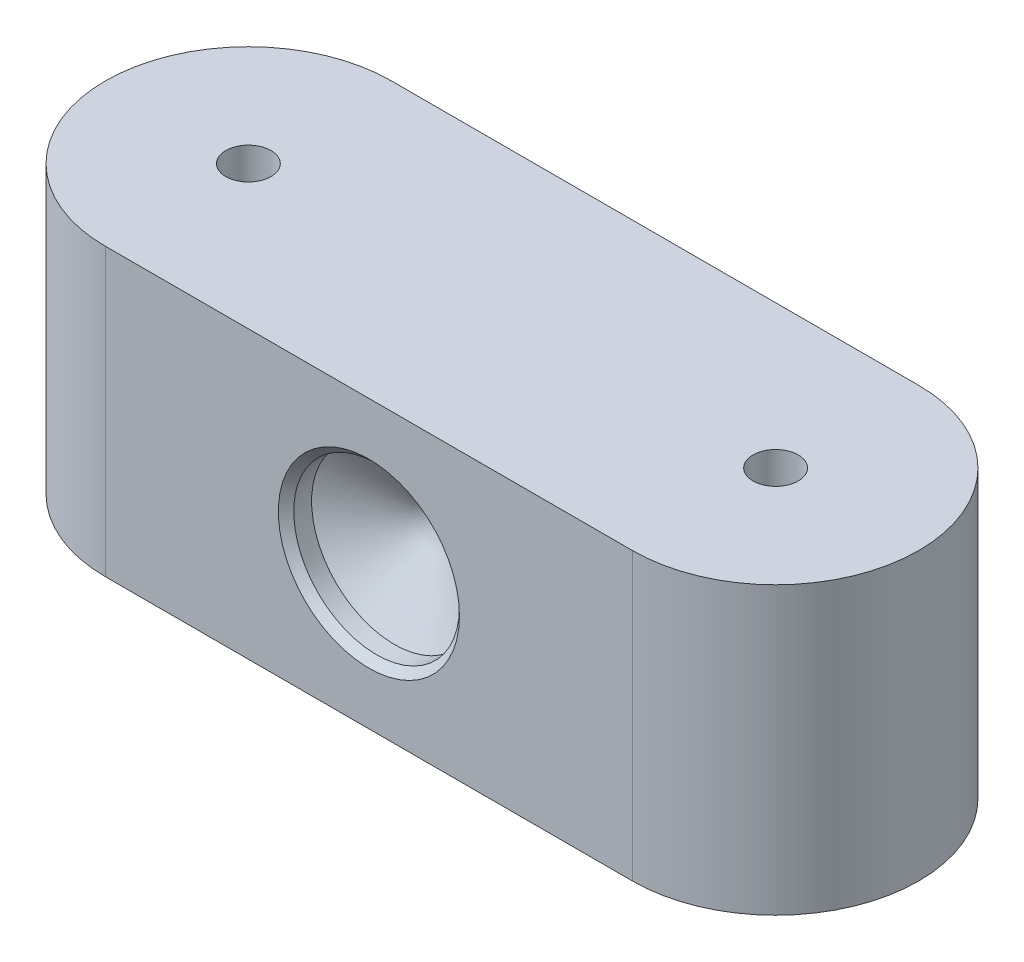
ISO-10303-21;
HEADER;
FILE_DESCRIPTION(('STEP AP214'),'2;1');
FILE_NAME('part.step','',(''),(''),'','','');
FILE_SCHEMA(('AUTOMOTIVE_DESIGN { 1 0 10303 214 1 1 1 1 }'));
ENDSEC;
DATA;
#1=APPLICATION_CONTEXT('core data for automotive mechanical design processes');
#2=APPLICATION_PROTOCOL_DEFINITION('international standard','automotive_design',2000,#1);
#3=PRODUCT_CONTEXT('',#1,'mechanical');
#4=PRODUCT('Part','Part','',(#3));
#5=PRODUCT_RELATED_PRODUCT_CATEGORY('part','',(#4));
#6=PRODUCT_DEFINITION_FORMATION('','',#4);
#7=PRODUCT_DEFINITION_CONTEXT('part definition',#1,'design');
#8=PRODUCT_DEFINITION('design','',#6,#7);
#9=PRODUCT_DEFINITION_SHAPE('','',#8);
#10=(LENGTH_UNIT() NAMED_UNIT(*) SI_UNIT(.MILLI.,.METRE.));
#11=(NAMED_UNIT(*) PLANE_ANGLE_UNIT() SI_UNIT($,.RADIAN.));
#12=(NAMED_UNIT(*) SI_UNIT($,.STERADIAN.) SOLID_ANGLE_UNIT());
#13=UNCERTAINTY_MEASURE_WITH_UNIT(LENGTH_MEASURE(1.E-05),#10,'distance_accuracy_value','');
#14=(GEOMETRIC_REPRESENTATION_CONTEXT(3) GLOBAL_UNCERTAINTY_ASSIGNED_CONTEXT((#13)) GLOBAL_UNIT_ASSIGNED_CONTEXT((#10,
#11,#12)) REPRESENTATION_CONTEXT('',''));
#15=CARTESIAN_POINT('',(0.,0.,0.));
#16=DIRECTION('',(0.,0.,1.));
#17=DIRECTION('',(1.,0.,0.));
#18=AXIS2_PLACEMENT_3D('',#15,#16,#17);
#19=CARTESIAN_POINT('',(-35.,19.,0.));
#20=DIRECTION('',(0.,1.,0.));
#21=DIRECTION('',(0.,0.,1.));
#22=AXIS2_PLACEMENT_3D('',#19,#20,#21);
#23=PLANE('',#22);
#24=CARTESIAN_POINT('',(-35.,19.,0.));
#25=DIRECTION('',(0.,1.,0.));
#26=DIRECTION('',(0.,0.,1.));
#27=AXIS2_PLACEMENT_3D('',#24,#25,#26);
#28=CIRCLE('',#27,3.);
#29=CARTESIAN_POINT('',(-35.,19.,3.));
#30=VERTEX_POINT('',#29);
#31=EDGE_CURVE('E130',#30,#30,#28,.T.);
#32=ORIENTED_EDGE('',*,*,#31,.F.);
#33=EDGE_LOOP('',(#32));
#34=FACE_BOUND('',#33,.T.);
#35=CARTESIAN_POINT('',(-35.,19.,0.));
#36=DIRECTION('',(0.,1.,0.));
#37=DIRECTION('',(0.,0.,1.));
#38=AXIS2_PLACEMENT_3D('',#35,#36,#37);
#39=CIRCLE('',#38,19.);
#40=CARTESIAN_POINT('',(-35.,19.,-19.));
#41=VERTEX_POINT('',#40);
#42=CARTESIAN_POINT('',(-35.,19.,19.));
#43=VERTEX_POINT('',#42);
#44=EDGE_CURVE('E138',#41,#43,#39,.T.);
#45=ORIENTED_EDGE('',*,*,#44,.T.);
#46=DIRECTION('',(1.,0.,0.));
#47=VECTOR('',#46,1.);
#48=CARTESIAN_POINT('',(-35.,19.,19.));
#49=LINE('',#48,#47);
#50=CARTESIAN_POINT('',(35.,19.,19.));
#51=VERTEX_POINT('',#50);
#52=EDGE_CURVE('E98',#43,#51,#49,.T.);
#53=ORIENTED_EDGE('',*,*,#52,.T.);
#54=CARTESIAN_POINT('',(35.,19.,0.));
#55=DIRECTION('',(0.,1.,0.));
#56=DIRECTION('',(0.,0.,1.));
#57=AXIS2_PLACEMENT_3D('',#54,#55,#56);
#58=CIRCLE('',#57,19.);
#59=CARTESIAN_POINT('',(35.,19.,-19.));
#60=VERTEX_POINT('',#59);
#61=EDGE_CURVE('E143',#51,#60,#58,.T.);
#62=ORIENTED_EDGE('',*,*,#61,.T.);
#63=DIRECTION('',(-1.,0.,0.));
#64=VECTOR('',#63,1.);
#65=CARTESIAN_POINT('',(-35.,19.,-19.));
#66=LINE('',#65,#64);
#67=EDGE_CURVE('E67',#60,#41,#66,.T.);
#68=ORIENTED_EDGE('',*,*,#67,.T.);
#69=EDGE_LOOP('',(#45,#53,#62,#68));
#70=FACE_BOUND('',#69,.T.);
#71=CARTESIAN_POINT('',(35.,19.,0.));
#72=DIRECTION('',(0.,1.,0.));
#73=DIRECTION('',(0.,0.,1.));
#74=AXIS2_PLACEMENT_3D('',#71,#72,#73);
#75=CIRCLE('',#74,3.);
#76=CARTESIAN_POINT('',(35.,19.,2.99999999999999));
#77=VERTEX_POINT('',#76);
#78=EDGE_CURVE('E119',#77,#77,#75,.T.);
#79=ORIENTED_EDGE('',*,*,#78,.F.);
#80=EDGE_LOOP('',(#79));
#81=FACE_BOUND('',#80,.T.);
#82=ADVANCED_FACE('F49',(#34,#70,#81),#23,.T.);
#83=CARTESIAN_POINT('',(-35.,-19.,0.));
#84=DIRECTION('',(0.,1.,0.));
#85=DIRECTION('',(0.,0.,1.));
#86=AXIS2_PLACEMENT_3D('',#83,#84,#85);
#87=PLANE('',#86);
#88=CARTESIAN_POINT('',(-35.,-19.,0.));
#89=DIRECTION('',(0.,1.,0.));
#90=DIRECTION('',(0.,0.,1.));
#91=AXIS2_PLACEMENT_3D('',#88,#89,#90);
#92=CIRCLE('',#91,19.);
#93=CARTESIAN_POINT('',(-35.,-19.,-19.));
#94=VERTEX_POINT('',#93);
#95=CARTESIAN_POINT('',(-35.,-19.,19.));
#96=VERTEX_POINT('',#95);
#97=EDGE_CURVE('E134',#94,#96,#92,.T.);
#98=ORIENTED_EDGE('',*,*,#97,.F.);
#99=DIRECTION('',(-1.,0.,0.));
#100=VECTOR('',#99,1.);
#101=CARTESIAN_POINT('',(-35.,-19.,-19.));
#102=LINE('',#101,#100);
#103=CARTESIAN_POINT('',(35.,-19.,-19.));
#104=VERTEX_POINT('',#103);
#105=EDGE_CURVE('E91',#104,#94,#102,.T.);
#106=ORIENTED_EDGE('',*,*,#105,.F.);
#107=CARTESIAN_POINT('',(35.,-19.,0.));
#108=DIRECTION('',(0.,1.,0.));
#109=DIRECTION('',(0.,0.,1.));
#110=AXIS2_PLACEMENT_3D('',#107,#108,#109);
#111=CIRCLE('',#110,19.);
#112=CARTESIAN_POINT('',(35.,-19.,19.));
#113=VERTEX_POINT('',#112);
#114=EDGE_CURVE('E85',#113,#104,#111,.T.);
#115=ORIENTED_EDGE('',*,*,#114,.F.);
#116=DIRECTION('',(1.,0.,0.));
#117=VECTOR('',#116,1.);
#118=CARTESIAN_POINT('',(-35.,-19.,19.));
#119=LINE('',#118,#117);
#120=EDGE_CURVE('E152',#96,#113,#119,.T.);
#121=ORIENTED_EDGE('',*,*,#120,.F.);
#122=EDGE_LOOP('',(#98,#106,#115,#121));
#123=FACE_BOUND('',#122,.T.);
#124=CARTESIAN_POINT('',(-35.,-19.,0.));
#125=DIRECTION('',(0.,1.,0.));
#126=DIRECTION('',(0.,0.,1.));
#127=AXIS2_PLACEMENT_3D('',#124,#125,#126);
#128=CIRCLE('',#127,3.);
#129=CARTESIAN_POINT('',(-35.,-19.,3.));
#130=VERTEX_POINT('',#129);
#131=EDGE_CURVE('E128',#130,#130,#128,.T.);
#132=ORIENTED_EDGE('',*,*,#131,.T.);
#133=EDGE_LOOP('',(#132));
#134=FACE_BOUND('',#133,.T.);
#135=CARTESIAN_POINT('',(35.,-19.,0.));
#136=DIRECTION('',(0.,1.,0.));
#137=DIRECTION('',(0.,0.,1.));
#138=AXIS2_PLACEMENT_3D('',#135,#136,#137);
#139=CIRCLE('',#138,3.);
#140=CARTESIAN_POINT('',(35.,-19.,2.99999999999999));
#141=VERTEX_POINT('',#140);
#142=EDGE_CURVE('E113',#141,#141,#139,.T.);
#143=ORIENTED_EDGE('',*,*,#142,.T.);
#144=EDGE_LOOP('',(#143));
#145=FACE_BOUND('',#144,.T.);
#146=ADVANCED_FACE('F168',(#123,#134,#145),#87,.F.);
#147=CARTESIAN_POINT('',(-35.,19.,0.));
#148=DIRECTION('',(0.,-1.,0.));
#149=DIRECTION('',(0.,0.,-1.));
#150=AXIS2_PLACEMENT_3D('',#147,#148,#149);
#151=CYLINDRICAL_SURFACE('',#150,19.);
#152=ORIENTED_EDGE('',*,*,#97,.T.);
#153=DIRECTION('',(0.,-1.,0.));
#154=VECTOR('',#153,1.);
#155=CARTESIAN_POINT('',(-35.,19.,19.));
#156=LINE('',#155,#154);
#157=EDGE_CURVE('E11',#43,#96,#156,.T.);
#158=ORIENTED_EDGE('',*,*,#157,.F.);
#159=ORIENTED_EDGE('',*,*,#44,.F.);
#160=DIRECTION('',(0.,-1.,0.));
#161=VECTOR('',#160,1.);
#162=CARTESIAN_POINT('',(-35.,19.,-19.));
#163=LINE('',#162,#161);
#164=EDGE_CURVE('E148',#41,#94,#163,.T.);
#165=ORIENTED_EDGE('',*,*,#164,.T.);
#166=EDGE_LOOP('',(#152,#158,#159,#165));
#167=FACE_BOUND('',#166,.T.);
#168=ADVANCED_FACE('F51',(#167),#151,.T.);
#169=CARTESIAN_POINT('',(-35.,19.,19.));
#170=DIRECTION('',(0.,0.,-1.));
#171=DIRECTION('',(-1.,0.,0.));
#172=AXIS2_PLACEMENT_3D('',#169,#170,#171);
#173=PLANE('',#172);
#174=CARTESIAN_POINT('',(0.,0.,19.));
#175=DIRECTION('',(0.,0.,1.));
#176=DIRECTION('',(1.,0.,0.));
#177=AXIS2_PLACEMENT_3D('',#174,#175,#176);
#178=CIRCLE('',#177,12.025);
#179=CARTESIAN_POINT('',(12.025,0.,19.));
#180=VERTEX_POINT('',#179);
#181=EDGE_CURVE('E122',#180,#180,#178,.T.);
#182=ORIENTED_EDGE('',*,*,#181,.F.);
#183=EDGE_LOOP('',(#182));
#184=FACE_BOUND('',#183,.T.);
#185=ORIENTED_EDGE('',*,*,#120,.T.);
#186=DIRECTION('',(0.,-1.,0.));
#187=VECTOR('',#186,1.);
#188=CARTESIAN_POINT('',(35.,19.,19.));
#189=LINE('',#188,#187);
#190=EDGE_CURVE('E59',#51,#113,#189,.T.);
#191=ORIENTED_EDGE('',*,*,#190,.F.);
#192=ORIENTED_EDGE('',*,*,#52,.F.);
#193=ORIENTED_EDGE('',*,*,#157,.T.);
#194=EDGE_LOOP('',(#185,#191,#192,#193));
#195=FACE_BOUND('',#194,.T.);
#196=ADVANCED_FACE('F183',(#184,#195),#173,.F.);
#197=CARTESIAN_POINT('',(35.,19.,0.));
#198=DIRECTION('',(0.,-1.,0.));
#199=DIRECTION('',(0.,0.,-1.));
#200=AXIS2_PLACEMENT_3D('',#197,#198,#199);
#201=CYLINDRICAL_SURFACE('',#200,19.);
#202=ORIENTED_EDGE('',*,*,#114,.T.);
#203=DIRECTION('',(0.,-1.,0.));
#204=VECTOR('',#203,1.);
#205=CARTESIAN_POINT('',(35.,19.,-19.));
#206=LINE('',#205,#204);
#207=EDGE_CURVE('E161',#60,#104,#206,.T.);
#208=ORIENTED_EDGE('',*,*,#207,.F.);
#209=ORIENTED_EDGE('',*,*,#61,.F.);
#210=ORIENTED_EDGE('',*,*,#190,.T.);
#211=EDGE_LOOP('',(#202,#208,#209,#210));
#212=FACE_BOUND('',#211,.T.);
#213=ADVANCED_FACE('F165',(#212),#201,.T.);
#214=CARTESIAN_POINT('',(-35.,19.,-19.));
#215=DIRECTION('',(0.,0.,1.));
#216=DIRECTION('',(1.,0.,0.));
#217=AXIS2_PLACEMENT_3D('',#214,#215,#216);
#218=PLANE('',#217);
#219=ORIENTED_EDGE('',*,*,#105,.T.);
#220=ORIENTED_EDGE('',*,*,#164,.F.);
#221=ORIENTED_EDGE('',*,*,#67,.F.);
#222=ORIENTED_EDGE('',*,*,#207,.T.);
#223=EDGE_LOOP('',(#219,#220,#221,#222));
#224=FACE_BOUND('',#223,.T.);
#225=ADVANCED_FACE('F173',(#224),#218,.F.);
#226=CARTESIAN_POINT('',(-35.,19.,0.));
#227=DIRECTION('',(0.,-1.,0.));
#228=DIRECTION('',(0.,0.,-1.));
#229=AXIS2_PLACEMENT_3D('',#226,#227,#228);
#230=CYLINDRICAL_SURFACE('',#229,3.);
#231=ORIENTED_EDGE('',*,*,#31,.T.);
#232=EDGE_LOOP('',(#231));
#233=FACE_BOUND('',#232,.T.);
#234=ORIENTED_EDGE('',*,*,#131,.F.);
#235=EDGE_LOOP('',(#234));
#236=FACE_BOUND('',#235,.T.);
#237=ADVANCED_FACE('F175',(#233,#236),#230,.F.);
#238=CARTESIAN_POINT('',(35.,19.,0.));
#239=DIRECTION('',(0.,-1.,0.));
#240=DIRECTION('',(0.,0.,-1.));
#241=AXIS2_PLACEMENT_3D('',#238,#239,#240);
#242=CYLINDRICAL_SURFACE('',#241,3.);
#243=ORIENTED_EDGE('',*,*,#78,.T.);
#244=EDGE_LOOP('',(#243));
#245=FACE_BOUND('',#244,.T.);
#246=ORIENTED_EDGE('',*,*,#142,.F.);
#247=EDGE_LOOP('',(#246));
#248=FACE_BOUND('',#247,.T.);
#249=ADVANCED_FACE('F106',(#245,#248),#242,.F.);
#250=CARTESIAN_POINT('',(0.,0.,15.6094668093031));
#251=DIRECTION('',(0.,0.,1.));
#252=DIRECTION('',(1.,0.,0.));
#253=AXIS2_PLACEMENT_3D('',#250,#251,#252);
#254=CONICAL_SURFACE('',#253,11.,1.02974425867665);
#255=CARTESIAN_POINT('',(0.,0.,8.99999999999999));
#256=VERTEX_POINT('',#255);
#257=VERTEX_LOOP('',#256);
#258=FACE_BOUND('',#257,.T.);
#259=CARTESIAN_POINT('',(0.,0.,15.6094668093031));
#260=DIRECTION('',(0.,0.,1.));
#261=DIRECTION('',(1.,0.,0.));
#262=AXIS2_PLACEMENT_3D('',#259,#260,#261);
#263=CIRCLE('',#262,11.);
#264=CARTESIAN_POINT('',(11.,0.,15.6094668093031));
#265=VERTEX_POINT('',#264);
#266=EDGE_CURVE('E110',#265,#265,#263,.T.);
#267=ORIENTED_EDGE('',*,*,#266,.T.);
#268=EDGE_LOOP('',(#267));
#269=FACE_BOUND('',#268,.T.);
#270=ADVANCED_FACE('F102',(#258,#269),#254,.F.);
#271=CARTESIAN_POINT('',(0.,0.,19.));
#272=DIRECTION('',(0.,0.,1.));
#273=DIRECTION('',(1.,0.,0.));
#274=AXIS2_PLACEMENT_3D('',#271,#272,#273);
#275=CYLINDRICAL_SURFACE('',#274,11.);
#276=ORIENTED_EDGE('',*,*,#266,.F.);
#277=EDGE_LOOP('',(#276));
#278=FACE_BOUND('',#277,.T.);
#279=CARTESIAN_POINT('',(0.,0.,17.975));
#280=DIRECTION('',(0.,0.,1.));
#281=DIRECTION('',(1.,0.,0.));
#282=AXIS2_PLACEMENT_3D('',#279,#280,#281);
#283=CIRCLE('',#282,11.);
#284=CARTESIAN_POINT('',(11.,0.,17.975));
#285=VERTEX_POINT('',#284);
#286=EDGE_CURVE('E114',#285,#285,#283,.T.);
#287=ORIENTED_EDGE('',*,*,#286,.T.);
#288=EDGE_LOOP('',(#287));
#289=FACE_BOUND('',#288,.T.);
#290=ADVANCED_FACE('F105',(#278,#289),#275,.F.);
#291=CARTESIAN_POINT('',(0.,0.,19.));
#292=DIRECTION('',(0.,0.,1.));
#293=DIRECTION('',(1.,0.,0.));
#294=AXIS2_PLACEMENT_3D('',#291,#292,#293);
#295=CONICAL_SURFACE('',#294,12.025,0.785398163397452);
#296=ORIENTED_EDGE('',*,*,#286,.F.);
#297=EDGE_LOOP('',(#296));
#298=FACE_BOUND('',#297,.T.);
#299=ORIENTED_EDGE('',*,*,#181,.T.);
#300=EDGE_LOOP('',(#299));
#301=FACE_BOUND('',#300,.T.);
#302=ADVANCED_FACE('F199',(#298,#301),#295,.F.);
#303=CLOSED_SHELL('',(#82,#146,#168,#196,#213,#225,#237,#249,#270,#290,#302));
#304=MANIFOLD_SOLID_BREP('B2',#303);
#305=ADVANCED_BREP_SHAPE_REPRESENTATION('',(#18,#304),#14);
#306=SHAPE_DEFINITION_REPRESENTATION(#9,#305);
ENDSEC;
END-ISO-10303-21;
